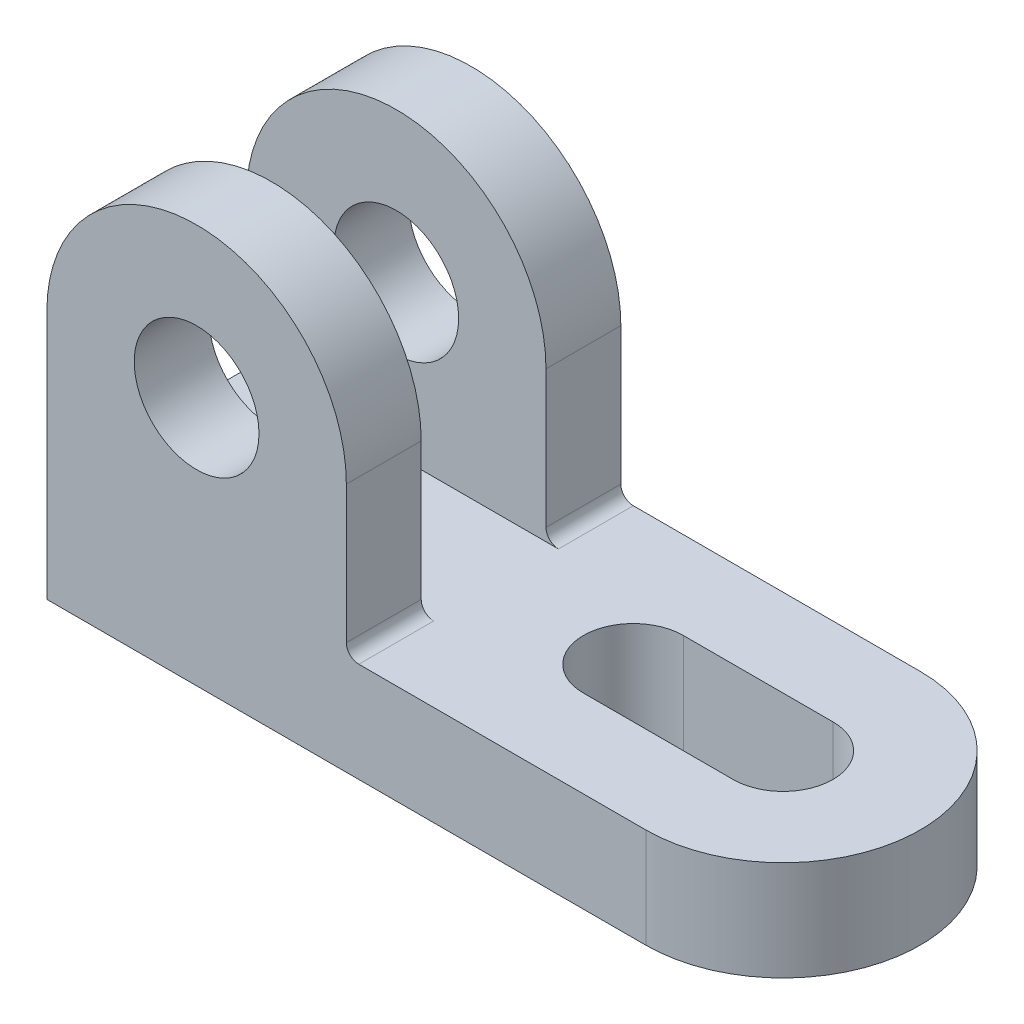
ISO-10303-21;
HEADER;
FILE_DESCRIPTION(('STEP AP214'),'2;1');
FILE_NAME('part.step','',(''),(''),'','','');
FILE_SCHEMA(('AUTOMOTIVE_DESIGN { 1 0 10303 214 1 1 1 1 }'));
ENDSEC;
DATA;
#1=APPLICATION_CONTEXT('core data for automotive mechanical design processes');
#2=APPLICATION_PROTOCOL_DEFINITION('international standard','automotive_design',2000,#1);
#3=PRODUCT_CONTEXT('',#1,'mechanical');
#4=PRODUCT('Part','Part','',(#3));
#5=PRODUCT_RELATED_PRODUCT_CATEGORY('part','',(#4));
#6=PRODUCT_DEFINITION_FORMATION('','',#4);
#7=PRODUCT_DEFINITION_CONTEXT('part definition',#1,'design');
#8=PRODUCT_DEFINITION('design','',#6,#7);
#9=PRODUCT_DEFINITION_SHAPE('','',#8);
#10=(LENGTH_UNIT() NAMED_UNIT(*) SI_UNIT(.MILLI.,.METRE.));
#11=(NAMED_UNIT(*) PLANE_ANGLE_UNIT() SI_UNIT($,.RADIAN.));
#12=(NAMED_UNIT(*) SI_UNIT($,.STERADIAN.) SOLID_ANGLE_UNIT());
#13=UNCERTAINTY_MEASURE_WITH_UNIT(LENGTH_MEASURE(1.E-05),#10,'distance_accuracy_value','');
#14=(GEOMETRIC_REPRESENTATION_CONTEXT(3) GLOBAL_UNCERTAINTY_ASSIGNED_CONTEXT((#13)) GLOBAL_UNIT_ASSIGNED_CONTEXT((#10,
#11,#12)) REPRESENTATION_CONTEXT('',''));
#15=CARTESIAN_POINT('',(0.,0.,0.));
#16=DIRECTION('',(0.,0.,1.));
#17=DIRECTION('',(1.,0.,0.));
#18=AXIS2_PLACEMENT_3D('',#15,#16,#17);
#19=CARTESIAN_POINT('',(0.,16.,0.));
#20=DIRECTION('',(0.,1.,0.));
#21=DIRECTION('',(0.,0.,1.));
#22=AXIS2_PLACEMENT_3D('',#19,#20,#21);
#23=PLANE('',#22);
#24=CARTESIAN_POINT('',(13.,16.,0.));
#25=DIRECTION('',(0.,1.,0.));
#26=DIRECTION('',(0.,0.,1.));
#27=AXIS2_PLACEMENT_3D('',#24,#25,#26);
#28=CIRCLE('',#27,8.);
#29=CARTESIAN_POINT('',(13.,16.,-8.));
#30=VERTEX_POINT('',#29);
#31=CARTESIAN_POINT('',(13.,16.,8.));
#32=VERTEX_POINT('',#31);
#33=EDGE_CURVE('E160',#30,#32,#28,.T.);
#34=ORIENTED_EDGE('',*,*,#33,.F.);
#35=DIRECTION('',(-1.,0.,0.));
#36=VECTOR('',#35,1.);
#37=CARTESIAN_POINT('',(13.,16.,-8.));
#38=LINE('',#37,#36);
#39=CARTESIAN_POINT('',(37.,16.,-8.));
#40=VERTEX_POINT('',#39);
#41=EDGE_CURVE('E181',#40,#30,#38,.T.);
#42=ORIENTED_EDGE('',*,*,#41,.F.);
#43=CARTESIAN_POINT('',(37.,16.,0.));
#44=DIRECTION('',(0.,1.,0.));
#45=DIRECTION('',(0.,0.,1.));
#46=AXIS2_PLACEMENT_3D('',#43,#44,#45);
#47=CIRCLE('',#46,8.);
#48=CARTESIAN_POINT('',(37.,16.,8.));
#49=VERTEX_POINT('',#48);
#50=EDGE_CURVE('E185',#49,#40,#47,.T.);
#51=ORIENTED_EDGE('',*,*,#50,.F.);
#52=DIRECTION('',(1.,0.,0.));
#53=VECTOR('',#52,1.);
#54=CARTESIAN_POINT('',(13.,16.,8.));
#55=LINE('',#54,#53);
#56=EDGE_CURVE('E194',#32,#49,#55,.T.);
#57=ORIENTED_EDGE('',*,*,#56,.F.);
#58=EDGE_LOOP('',(#34,#42,#51,#57));
#59=FACE_BOUND('',#58,.T.);
#60=DIRECTION('',(1.,0.,0.));
#61=VECTOR('',#60,1.);
#62=CARTESIAN_POINT('',(0.,16.,-22.));
#63=LINE('',#62,#61);
#64=CARTESIAN_POINT('',(-8.99999999999996,16.,-22.));
#65=VERTEX_POINT('',#64);
#66=CARTESIAN_POINT('',(37.,16.,-22.));
#67=VERTEX_POINT('',#66);
#68=EDGE_CURVE('E291',#65,#67,#63,.T.);
#69=ORIENTED_EDGE('',*,*,#68,.F.);
#70=DIRECTION('',(0.,0.,-1.));
#71=VECTOR('',#70,1.);
#72=CARTESIAN_POINT('',(-8.99999999999996,16.,0.));
#73=LINE('',#72,#71);
#74=CARTESIAN_POINT('',(-8.99999999999996,16.,-10.));
#75=VERTEX_POINT('',#74);
#76=EDGE_CURVE('E332',#65,#75,#73,.F.);
#77=ORIENTED_EDGE('',*,*,#76,.T.);
#78=DIRECTION('',(-1.,0.,0.));
#79=VECTOR('',#78,1.);
#80=CARTESIAN_POINT('',(0.,16.,-10.));
#81=LINE('',#80,#79);
#82=CARTESIAN_POINT('',(-59.,16.,-10.));
#83=VERTEX_POINT('',#82);
#84=EDGE_CURVE('E217',#75,#83,#81,.T.);
#85=ORIENTED_EDGE('',*,*,#84,.T.);
#86=DIRECTION('',(0.,0.,1.));
#87=VECTOR('',#86,1.);
#88=CARTESIAN_POINT('',(-59.,16.,0.));
#89=LINE('',#88,#87);
#90=CARTESIAN_POINT('',(-59.,16.,10.));
#91=VERTEX_POINT('',#90);
#92=EDGE_CURVE('E294',#83,#91,#89,.T.);
#93=ORIENTED_EDGE('',*,*,#92,.T.);
#94=DIRECTION('',(-1.,0.,0.));
#95=VECTOR('',#94,1.);
#96=CARTESIAN_POINT('',(0.,16.,10.));
#97=LINE('',#96,#95);
#98=CARTESIAN_POINT('',(-8.99999999999996,16.,10.));
#99=VERTEX_POINT('',#98);
#100=EDGE_CURVE('E261',#99,#91,#97,.T.);
#101=ORIENTED_EDGE('',*,*,#100,.F.);
#102=DIRECTION('',(0.,0.,1.));
#103=VECTOR('',#102,1.);
#104=CARTESIAN_POINT('',(-8.99999999999996,16.,22.));
#105=LINE('',#104,#103);
#106=CARTESIAN_POINT('',(-8.99999999999996,16.,22.));
#107=VERTEX_POINT('',#106);
#108=EDGE_CURVE('E328',#99,#107,#105,.T.);
#109=ORIENTED_EDGE('',*,*,#108,.T.);
#110=DIRECTION('',(1.,0.,0.));
#111=VECTOR('',#110,1.);
#112=CARTESIAN_POINT('',(0.,16.,22.));
#113=LINE('',#112,#111);
#114=CARTESIAN_POINT('',(37.,16.,22.));
#115=VERTEX_POINT('',#114);
#116=EDGE_CURVE('E283',#107,#115,#113,.T.);
#117=ORIENTED_EDGE('',*,*,#116,.T.);
#118=CARTESIAN_POINT('',(37.,16.,0.));
#119=DIRECTION('',(0.,1.,0.));
#120=DIRECTION('',(0.,0.,1.));
#121=AXIS2_PLACEMENT_3D('',#118,#119,#120);
#122=CIRCLE('',#121,22.);
#123=EDGE_CURVE('E286',#115,#67,#122,.T.);
#124=ORIENTED_EDGE('',*,*,#123,.T.);
#125=EDGE_LOOP('',(#69,#77,#85,#93,#101,#109,#117,#124));
#126=FACE_BOUND('',#125,.T.);
#127=ADVANCED_FACE('F40',(#59,#126),#23,.T.);
#128=CARTESIAN_POINT('',(0.,16.,22.));
#129=DIRECTION('',(0.,0.,-1.));
#130=DIRECTION('',(-1.,0.,0.));
#131=AXIS2_PLACEMENT_3D('',#128,#129,#130);
#132=PLANE('',#131);
#133=DIRECTION('',(1.,0.,0.));
#134=VECTOR('',#133,1.);
#135=CARTESIAN_POINT('',(0.,0.,22.));
#136=LINE('',#135,#134);
#137=CARTESIAN_POINT('',(-59.,0.,22.));
#138=VERTEX_POINT('',#137);
#139=CARTESIAN_POINT('',(37.,0.,22.));
#140=VERTEX_POINT('',#139);
#141=EDGE_CURVE('E279',#138,#140,#136,.T.);
#142=ORIENTED_EDGE('',*,*,#141,.T.);
#143=DIRECTION('',(0.,-1.,0.));
#144=VECTOR('',#143,1.);
#145=CARTESIAN_POINT('',(37.,16.,22.));
#146=LINE('',#145,#144);
#147=EDGE_CURVE('E320',#115,#140,#146,.T.);
#148=ORIENTED_EDGE('',*,*,#147,.F.);
#149=ORIENTED_EDGE('',*,*,#116,.F.);
#150=CARTESIAN_POINT('',(-8.99999999999996,18.,22.));
#151=DIRECTION('',(0.,0.,-1.));
#152=DIRECTION('',(-1.,0.,0.));
#153=AXIS2_PLACEMENT_3D('',#150,#151,#152);
#154=CIRCLE('',#153,2.);
#155=CARTESIAN_POINT('',(-11.,18.,22.));
#156=VERTEX_POINT('',#155);
#157=EDGE_CURVE('E49',#107,#156,#154,.T.);
#158=ORIENTED_EDGE('',*,*,#157,.T.);
#159=DIRECTION('',(0.,1.,0.));
#160=VECTOR('',#159,1.);
#161=CARTESIAN_POINT('',(-11.,0.,22.));
#162=LINE('',#161,#160);
#163=CARTESIAN_POINT('',(-11.,40.,22.));
#164=VERTEX_POINT('',#163);
#165=EDGE_CURVE('E269',#156,#164,#162,.T.);
#166=ORIENTED_EDGE('',*,*,#165,.T.);
#167=CARTESIAN_POINT('',(-35.,40.,22.));
#168=DIRECTION('',(0.,0.,1.));
#169=DIRECTION('',(1.,0.,0.));
#170=AXIS2_PLACEMENT_3D('',#167,#168,#169);
#171=CIRCLE('',#170,24.);
#172=CARTESIAN_POINT('',(-59.,40.,22.));
#173=VERTEX_POINT('',#172);
#174=EDGE_CURVE('E251',#164,#173,#171,.T.);
#175=ORIENTED_EDGE('',*,*,#174,.T.);
#176=DIRECTION('',(0.,-1.,0.));
#177=VECTOR('',#176,1.);
#178=CARTESIAN_POINT('',(-59.,16.,22.));
#179=LINE('',#178,#177);
#180=EDGE_CURVE('E297',#173,#138,#179,.T.);
#181=ORIENTED_EDGE('',*,*,#180,.T.);
#182=EDGE_LOOP('',(#142,#148,#149,#158,#166,#175,#181));
#183=FACE_BOUND('',#182,.T.);
#184=CARTESIAN_POINT('',(-35.,40.,22.));
#185=DIRECTION('',(0.,0.,1.));
#186=DIRECTION('',(1.,0.,0.));
#187=AXIS2_PLACEMENT_3D('',#184,#185,#186);
#188=CIRCLE('',#187,10.);
#189=CARTESIAN_POINT('',(-25.,40.,22.));
#190=VERTEX_POINT('',#189);
#191=EDGE_CURVE('E242',#190,#190,#188,.T.);
#192=ORIENTED_EDGE('',*,*,#191,.F.);
#193=EDGE_LOOP('',(#192));
#194=FACE_BOUND('',#193,.T.);
#195=ADVANCED_FACE('F374',(#183,#194),#132,.F.);
#196=CARTESIAN_POINT('',(37.,16.,0.));
#197=DIRECTION('',(0.,-1.,0.));
#198=DIRECTION('',(0.,0.,-1.));
#199=AXIS2_PLACEMENT_3D('',#196,#197,#198);
#200=CYLINDRICAL_SURFACE('',#199,22.);
#201=CARTESIAN_POINT('',(37.,0.,0.));
#202=DIRECTION('',(0.,1.,0.));
#203=DIRECTION('',(0.,0.,1.));
#204=AXIS2_PLACEMENT_3D('',#201,#202,#203);
#205=CIRCLE('',#204,22.);
#206=CARTESIAN_POINT('',(37.,0.,-22.));
#207=VERTEX_POINT('',#206);
#208=EDGE_CURVE('E301',#140,#207,#205,.T.);
#209=ORIENTED_EDGE('',*,*,#208,.T.);
#210=DIRECTION('',(0.,-1.,0.));
#211=VECTOR('',#210,1.);
#212=CARTESIAN_POINT('',(37.,16.,-22.));
#213=LINE('',#212,#211);
#214=EDGE_CURVE('E317',#67,#207,#213,.T.);
#215=ORIENTED_EDGE('',*,*,#214,.F.);
#216=ORIENTED_EDGE('',*,*,#123,.F.);
#217=ORIENTED_EDGE('',*,*,#147,.T.);
#218=EDGE_LOOP('',(#209,#215,#216,#217));
#219=FACE_BOUND('',#218,.T.);
#220=ADVANCED_FACE('F368',(#219),#200,.T.);
#221=CARTESIAN_POINT('',(0.,16.,-22.));
#222=DIRECTION('',(0.,0.,-1.));
#223=DIRECTION('',(-1.,0.,0.));
#224=AXIS2_PLACEMENT_3D('',#221,#222,#223);
#225=PLANE('',#224);
#226=DIRECTION('',(1.,0.,0.));
#227=VECTOR('',#226,1.);
#228=CARTESIAN_POINT('',(0.,0.,-22.));
#229=LINE('',#228,#227);
#230=CARTESIAN_POINT('',(-59.,0.,-22.));
#231=VERTEX_POINT('',#230);
#232=EDGE_CURVE('E305',#231,#207,#229,.T.);
#233=ORIENTED_EDGE('',*,*,#232,.F.);
#234=DIRECTION('',(0.,-1.,0.));
#235=VECTOR('',#234,1.);
#236=CARTESIAN_POINT('',(-59.,16.,-22.));
#237=LINE('',#236,#235);
#238=CARTESIAN_POINT('',(-59.,40.,-22.));
#239=VERTEX_POINT('',#238);
#240=EDGE_CURVE('E314',#239,#231,#237,.T.);
#241=ORIENTED_EDGE('',*,*,#240,.F.);
#242=CARTESIAN_POINT('',(-35.,40.,-22.));
#243=DIRECTION('',(0.,0.,1.));
#244=DIRECTION('',(1.,0.,0.));
#245=AXIS2_PLACEMENT_3D('',#242,#243,#244);
#246=CIRCLE('',#245,24.);
#247=CARTESIAN_POINT('',(-11.,40.,-22.));
#248=VERTEX_POINT('',#247);
#249=EDGE_CURVE('E214',#248,#239,#246,.T.);
#250=ORIENTED_EDGE('',*,*,#249,.F.);
#251=DIRECTION('',(0.,1.,0.));
#252=VECTOR('',#251,1.);
#253=CARTESIAN_POINT('',(-11.,0.,-22.));
#254=LINE('',#253,#252);
#255=CARTESIAN_POINT('',(-11.,18.,-22.));
#256=VERTEX_POINT('',#255);
#257=EDGE_CURVE('E232',#256,#248,#254,.T.);
#258=ORIENTED_EDGE('',*,*,#257,.F.);
#259=CARTESIAN_POINT('',(-8.99999999999996,18.,-22.));
#260=DIRECTION('',(0.,0.,-1.));
#261=DIRECTION('',(-1.,0.,0.));
#262=AXIS2_PLACEMENT_3D('',#259,#260,#261);
#263=CIRCLE('',#262,2.);
#264=EDGE_CURVE('E338',#256,#65,#263,.F.);
#265=ORIENTED_EDGE('',*,*,#264,.T.);
#266=ORIENTED_EDGE('',*,*,#68,.T.);
#267=ORIENTED_EDGE('',*,*,#214,.T.);
#268=EDGE_LOOP('',(#233,#241,#250,#258,#265,#266,#267));
#269=FACE_BOUND('',#268,.T.);
#270=CARTESIAN_POINT('',(-35.,40.,-22.));
#271=DIRECTION('',(0.,0.,1.));
#272=DIRECTION('',(1.,0.,0.));
#273=AXIS2_PLACEMENT_3D('',#270,#271,#272);
#274=CIRCLE('',#273,10.);
#275=CARTESIAN_POINT('',(-25.,40.,-22.));
#276=VERTEX_POINT('',#275);
#277=EDGE_CURVE('E203',#276,#276,#274,.T.);
#278=ORIENTED_EDGE('',*,*,#277,.T.);
#279=EDGE_LOOP('',(#278));
#280=FACE_BOUND('',#279,.T.);
#281=ADVANCED_FACE('F360',(#269,#280),#225,.T.);
#282=CARTESIAN_POINT('',(-59.,16.,0.));
#283=DIRECTION('',(1.,0.,0.));
#284=DIRECTION('',(0.,0.,-1.));
#285=AXIS2_PLACEMENT_3D('',#282,#283,#284);
#286=PLANE('',#285);
#287=DIRECTION('',(0.,0.,1.));
#288=VECTOR('',#287,1.);
#289=CARTESIAN_POINT('',(-59.,0.,0.));
#290=LINE('',#289,#288);
#291=EDGE_CURVE('E287',#231,#138,#290,.T.);
#292=ORIENTED_EDGE('',*,*,#291,.T.);
#293=ORIENTED_EDGE('',*,*,#180,.F.);
#294=DIRECTION('',(0.,0.,1.));
#295=VECTOR('',#294,1.);
#296=CARTESIAN_POINT('',(-59.,40.,10.));
#297=LINE('',#296,#295);
#298=CARTESIAN_POINT('',(-59.,40.,10.));
#299=VERTEX_POINT('',#298);
#300=EDGE_CURVE('E275',#299,#173,#297,.T.);
#301=ORIENTED_EDGE('',*,*,#300,.F.);
#302=DIRECTION('',(0.,1.,0.));
#303=VECTOR('',#302,1.);
#304=CARTESIAN_POINT('',(-59.,0.,10.));
#305=LINE('',#304,#303);
#306=EDGE_CURVE('E258',#91,#299,#305,.T.);
#307=ORIENTED_EDGE('',*,*,#306,.F.);
#308=ORIENTED_EDGE('',*,*,#92,.F.);
#309=DIRECTION('',(0.,1.,0.));
#310=VECTOR('',#309,1.);
#311=CARTESIAN_POINT('',(-59.,0.,-10.));
#312=LINE('',#311,#310);
#313=CARTESIAN_POINT('',(-59.,40.,-10.));
#314=VERTEX_POINT('',#313);
#315=EDGE_CURVE('E221',#83,#314,#312,.T.);
#316=ORIENTED_EDGE('',*,*,#315,.T.);
#317=DIRECTION('',(0.,0.,-1.));
#318=VECTOR('',#317,1.);
#319=CARTESIAN_POINT('',(-59.,40.,-10.));
#320=LINE('',#319,#318);
#321=EDGE_CURVE('E228',#314,#239,#320,.T.);
#322=ORIENTED_EDGE('',*,*,#321,.T.);
#323=ORIENTED_EDGE('',*,*,#240,.T.);
#324=EDGE_LOOP('',(#292,#293,#301,#307,#308,#316,#322,#323));
#325=FACE_BOUND('',#324,.T.);
#326=ADVANCED_FACE('F372',(#325),#286,.F.);
#327=CARTESIAN_POINT('',(0.,0.,0.));
#328=DIRECTION('',(0.,1.,0.));
#329=DIRECTION('',(0.,0.,1.));
#330=AXIS2_PLACEMENT_3D('',#327,#328,#329);
#331=PLANE('',#330);
#332=DIRECTION('',(-1.,0.,0.));
#333=VECTOR('',#332,1.);
#334=CARTESIAN_POINT('',(13.,0.,-8.));
#335=LINE('',#334,#333);
#336=CARTESIAN_POINT('',(37.,0.,-8.));
#337=VERTEX_POINT('',#336);
#338=CARTESIAN_POINT('',(13.,0.,-8.));
#339=VERTEX_POINT('',#338);
#340=EDGE_CURVE('E166',#337,#339,#335,.T.);
#341=ORIENTED_EDGE('',*,*,#340,.T.);
#342=CARTESIAN_POINT('',(13.,0.,0.));
#343=DIRECTION('',(0.,1.,0.));
#344=DIRECTION('',(0.,0.,1.));
#345=AXIS2_PLACEMENT_3D('',#342,#343,#344);
#346=CIRCLE('',#345,8.);
#347=CARTESIAN_POINT('',(13.,0.,8.));
#348=VERTEX_POINT('',#347);
#349=EDGE_CURVE('E157',#339,#348,#346,.T.);
#350=ORIENTED_EDGE('',*,*,#349,.T.);
#351=DIRECTION('',(1.,0.,0.));
#352=VECTOR('',#351,1.);
#353=CARTESIAN_POINT('',(13.,0.,8.));
#354=LINE('',#353,#352);
#355=CARTESIAN_POINT('',(37.,0.,8.));
#356=VERTEX_POINT('',#355);
#357=EDGE_CURVE('E170',#348,#356,#354,.T.);
#358=ORIENTED_EDGE('',*,*,#357,.T.);
#359=CARTESIAN_POINT('',(37.,0.,0.));
#360=DIRECTION('',(0.,1.,0.));
#361=DIRECTION('',(0.,0.,1.));
#362=AXIS2_PLACEMENT_3D('',#359,#360,#361);
#363=CIRCLE('',#362,8.);
#364=EDGE_CURVE('E175',#356,#337,#363,.T.);
#365=ORIENTED_EDGE('',*,*,#364,.T.);
#366=EDGE_LOOP('',(#341,#350,#358,#365));
#367=FACE_BOUND('',#366,.T.);
#368=ORIENTED_EDGE('',*,*,#141,.F.);
#369=ORIENTED_EDGE('',*,*,#291,.F.);
#370=ORIENTED_EDGE('',*,*,#232,.T.);
#371=ORIENTED_EDGE('',*,*,#208,.F.);
#372=EDGE_LOOP('',(#368,#369,#370,#371));
#373=FACE_BOUND('',#372,.T.);
#374=ADVANCED_FACE('F177',(#367,#373),#331,.F.);
#375=CARTESIAN_POINT('',(-11.,0.,10.));
#376=DIRECTION('',(1.,0.,0.));
#377=DIRECTION('',(0.,0.,-1.));
#378=AXIS2_PLACEMENT_3D('',#375,#376,#377);
#379=PLANE('',#378);
#380=ORIENTED_EDGE('',*,*,#165,.F.);
#381=DIRECTION('',(0.,0.,1.));
#382=VECTOR('',#381,1.);
#383=CARTESIAN_POINT('',(-11.,18.,10.));
#384=LINE('',#383,#382);
#385=CARTESIAN_POINT('',(-11.,18.,10.));
#386=VERTEX_POINT('',#385);
#387=EDGE_CURVE('E56',#156,#386,#384,.F.);
#388=ORIENTED_EDGE('',*,*,#387,.T.);
#389=DIRECTION('',(0.,1.,0.));
#390=VECTOR('',#389,1.);
#391=CARTESIAN_POINT('',(-11.,0.,10.));
#392=LINE('',#391,#390);
#393=CARTESIAN_POINT('',(-11.,40.,10.));
#394=VERTEX_POINT('',#393);
#395=EDGE_CURVE('E250',#386,#394,#392,.T.);
#396=ORIENTED_EDGE('',*,*,#395,.T.);
#397=DIRECTION('',(0.,0.,1.));
#398=VECTOR('',#397,1.);
#399=CARTESIAN_POINT('',(-11.,40.,10.));
#400=LINE('',#399,#398);
#401=EDGE_CURVE('E265',#394,#164,#400,.T.);
#402=ORIENTED_EDGE('',*,*,#401,.T.);
#403=EDGE_LOOP('',(#380,#388,#396,#402));
#404=FACE_BOUND('',#403,.T.);
#405=ADVANCED_FACE('F406',(#404),#379,.T.);
#406=CARTESIAN_POINT('',(-35.,40.,10.));
#407=DIRECTION('',(0.,0.,1.));
#408=DIRECTION('',(1.,0.,0.));
#409=AXIS2_PLACEMENT_3D('',#406,#407,#408);
#410=CYLINDRICAL_SURFACE('',#409,10.);
#411=CARTESIAN_POINT('',(-35.,40.,10.));
#412=DIRECTION('',(0.,0.,1.));
#413=DIRECTION('',(1.,0.,0.));
#414=AXIS2_PLACEMENT_3D('',#411,#412,#413);
#415=CIRCLE('',#414,10.);
#416=CARTESIAN_POINT('',(-25.,40.,10.));
#417=VERTEX_POINT('',#416);
#418=EDGE_CURVE('E246',#417,#417,#415,.T.);
#419=ORIENTED_EDGE('',*,*,#418,.F.);
#420=EDGE_LOOP('',(#419));
#421=FACE_BOUND('',#420,.T.);
#422=ORIENTED_EDGE('',*,*,#191,.T.);
#423=EDGE_LOOP('',(#422));
#424=FACE_BOUND('',#423,.T.);
#425=ADVANCED_FACE('F402',(#421,#424),#410,.F.);
#426=CARTESIAN_POINT('',(-35.,40.,10.));
#427=DIRECTION('',(0.,0.,1.));
#428=DIRECTION('',(1.,0.,0.));
#429=AXIS2_PLACEMENT_3D('',#426,#427,#428);
#430=CYLINDRICAL_SURFACE('',#429,24.);
#431=ORIENTED_EDGE('',*,*,#174,.F.);
#432=ORIENTED_EDGE('',*,*,#401,.F.);
#433=CARTESIAN_POINT('',(-35.,40.,10.));
#434=DIRECTION('',(0.,0.,1.));
#435=DIRECTION('',(1.,0.,0.));
#436=AXIS2_PLACEMENT_3D('',#433,#434,#435);
#437=CIRCLE('',#436,24.);
#438=EDGE_CURVE('E254',#394,#299,#437,.T.);
#439=ORIENTED_EDGE('',*,*,#438,.T.);
#440=ORIENTED_EDGE('',*,*,#300,.T.);
#441=EDGE_LOOP('',(#431,#432,#439,#440));
#442=FACE_BOUND('',#441,.T.);
#443=ADVANCED_FACE('F379',(#442),#430,.T.);
#444=CARTESIAN_POINT('',(0.,0.,10.));
#445=DIRECTION('',(0.,0.,1.));
#446=DIRECTION('',(1.,0.,0.));
#447=AXIS2_PLACEMENT_3D('',#444,#445,#446);
#448=PLANE('',#447);
#449=ORIENTED_EDGE('',*,*,#418,.T.);
#450=EDGE_LOOP('',(#449));
#451=FACE_BOUND('',#450,.T.);
#452=ORIENTED_EDGE('',*,*,#395,.F.);
#453=CARTESIAN_POINT('',(-8.99999999999996,18.,10.));
#454=DIRECTION('',(0.,0.,1.));
#455=DIRECTION('',(1.,0.,0.));
#456=AXIS2_PLACEMENT_3D('',#453,#454,#455);
#457=CIRCLE('',#456,2.);
#458=EDGE_CURVE('E11',#386,#99,#457,.T.);
#459=ORIENTED_EDGE('',*,*,#458,.T.);
#460=ORIENTED_EDGE('',*,*,#100,.T.);
#461=ORIENTED_EDGE('',*,*,#306,.T.);
#462=ORIENTED_EDGE('',*,*,#438,.F.);
#463=EDGE_LOOP('',(#452,#459,#460,#461,#462));
#464=FACE_BOUND('',#463,.T.);
#465=ADVANCED_FACE('F384',(#451,#464),#448,.F.);
#466=CARTESIAN_POINT('',(-11.,0.,-10.));
#467=DIRECTION('',(-1.,0.,0.));
#468=DIRECTION('',(0.,0.,1.));
#469=AXIS2_PLACEMENT_3D('',#466,#467,#468);
#470=PLANE('',#469);
#471=DIRECTION('',(0.,1.,0.));
#472=VECTOR('',#471,1.);
#473=CARTESIAN_POINT('',(-11.,0.,-10.));
#474=LINE('',#473,#472);
#475=CARTESIAN_POINT('',(-11.,18.,-10.));
#476=VERTEX_POINT('',#475);
#477=CARTESIAN_POINT('',(-11.,40.,-10.));
#478=VERTEX_POINT('',#477);
#479=EDGE_CURVE('E213',#476,#478,#474,.T.);
#480=ORIENTED_EDGE('',*,*,#479,.F.);
#481=DIRECTION('',(0.,0.,-1.));
#482=VECTOR('',#481,1.);
#483=CARTESIAN_POINT('',(-11.,18.,-10.));
#484=LINE('',#483,#482);
#485=EDGE_CURVE('E324',#476,#256,#484,.T.);
#486=ORIENTED_EDGE('',*,*,#485,.T.);
#487=ORIENTED_EDGE('',*,*,#257,.T.);
#488=DIRECTION('',(0.,0.,-1.));
#489=VECTOR('',#488,1.);
#490=CARTESIAN_POINT('',(-11.,40.,-10.));
#491=LINE('',#490,#489);
#492=EDGE_CURVE('E238',#478,#248,#491,.T.);
#493=ORIENTED_EDGE('',*,*,#492,.F.);
#494=EDGE_LOOP('',(#480,#486,#487,#493));
#495=FACE_BOUND('',#494,.T.);
#496=ADVANCED_FACE('F354',(#495),#470,.F.);
#497=CARTESIAN_POINT('',(-35.,40.,-10.));
#498=DIRECTION('',(0.,0.,-1.));
#499=DIRECTION('',(-1.,0.,0.));
#500=AXIS2_PLACEMENT_3D('',#497,#498,#499);
#501=CYLINDRICAL_SURFACE('',#500,24.);
#502=ORIENTED_EDGE('',*,*,#249,.T.);
#503=ORIENTED_EDGE('',*,*,#321,.F.);
#504=CARTESIAN_POINT('',(-35.,40.,-10.));
#505=DIRECTION('',(0.,0.,1.));
#506=DIRECTION('',(1.,0.,0.));
#507=AXIS2_PLACEMENT_3D('',#504,#505,#506);
#508=CIRCLE('',#507,24.);
#509=EDGE_CURVE('E225',#478,#314,#508,.T.);
#510=ORIENTED_EDGE('',*,*,#509,.F.);
#511=ORIENTED_EDGE('',*,*,#492,.T.);
#512=EDGE_LOOP('',(#502,#503,#510,#511));
#513=FACE_BOUND('',#512,.T.);
#514=ADVANCED_FACE('F473',(#513),#501,.T.);
#515=CARTESIAN_POINT('',(-35.,40.,-10.));
#516=DIRECTION('',(0.,0.,-1.));
#517=DIRECTION('',(-1.,0.,0.));
#518=AXIS2_PLACEMENT_3D('',#515,#516,#517);
#519=CYLINDRICAL_SURFACE('',#518,10.);
#520=CARTESIAN_POINT('',(-35.,40.,-10.));
#521=DIRECTION('',(0.,0.,1.));
#522=DIRECTION('',(1.,0.,0.));
#523=AXIS2_PLACEMENT_3D('',#520,#521,#522);
#524=CIRCLE('',#523,10.);
#525=CARTESIAN_POINT('',(-25.,40.,-10.));
#526=VERTEX_POINT('',#525);
#527=EDGE_CURVE('E209',#526,#526,#524,.T.);
#528=ORIENTED_EDGE('',*,*,#527,.T.);
#529=EDGE_LOOP('',(#528));
#530=FACE_BOUND('',#529,.T.);
#531=ORIENTED_EDGE('',*,*,#277,.F.);
#532=EDGE_LOOP('',(#531));
#533=FACE_BOUND('',#532,.T.);
#534=ADVANCED_FACE('F482',(#530,#533),#519,.F.);
#535=CARTESIAN_POINT('',(0.,0.,-10.));
#536=DIRECTION('',(0.,0.,-1.));
#537=DIRECTION('',(1.,0.,0.));
#538=AXIS2_PLACEMENT_3D('',#535,#536,#537);
#539=PLANE('',#538);
#540=ORIENTED_EDGE('',*,*,#527,.F.);
#541=EDGE_LOOP('',(#540));
#542=FACE_BOUND('',#541,.T.);
#543=ORIENTED_EDGE('',*,*,#84,.F.);
#544=CARTESIAN_POINT('',(-8.99999999999996,18.,-10.));
#545=DIRECTION('',(0.,0.,-1.));
#546=DIRECTION('',(-1.,0.,0.));
#547=AXIS2_PLACEMENT_3D('',#544,#545,#546);
#548=CIRCLE('',#547,2.);
#549=EDGE_CURVE('E341',#75,#476,#548,.T.);
#550=ORIENTED_EDGE('',*,*,#549,.T.);
#551=ORIENTED_EDGE('',*,*,#479,.T.);
#552=ORIENTED_EDGE('',*,*,#509,.T.);
#553=ORIENTED_EDGE('',*,*,#315,.F.);
#554=EDGE_LOOP('',(#543,#550,#551,#552,#553));
#555=FACE_BOUND('',#554,.T.);
#556=ADVANCED_FACE('F347',(#542,#555),#539,.F.);
#557=CARTESIAN_POINT('',(13.,0.,0.));
#558=DIRECTION('',(0.,1.,0.));
#559=DIRECTION('',(0.,0.,1.));
#560=AXIS2_PLACEMENT_3D('',#557,#558,#559);
#561=CYLINDRICAL_SURFACE('',#560,8.);
#562=ORIENTED_EDGE('',*,*,#33,.T.);
#563=DIRECTION('',(0.,1.,0.));
#564=VECTOR('',#563,1.);
#565=CARTESIAN_POINT('',(13.,0.,8.));
#566=LINE('',#565,#564);
#567=EDGE_CURVE('E153',#348,#32,#566,.T.);
#568=ORIENTED_EDGE('',*,*,#567,.F.);
#569=ORIENTED_EDGE('',*,*,#349,.F.);
#570=DIRECTION('',(0.,1.,0.));
#571=VECTOR('',#570,1.);
#572=CARTESIAN_POINT('',(13.,0.,-8.));
#573=LINE('',#572,#571);
#574=EDGE_CURVE('E200',#339,#30,#573,.T.);
#575=ORIENTED_EDGE('',*,*,#574,.T.);
#576=EDGE_LOOP('',(#562,#568,#569,#575));
#577=FACE_BOUND('',#576,.T.);
#578=ADVANCED_FACE('F155',(#577),#561,.F.);
#579=CARTESIAN_POINT('',(13.,0.,-8.));
#580=DIRECTION('',(0.,0.,-1.));
#581=DIRECTION('',(-1.,0.,0.));
#582=AXIS2_PLACEMENT_3D('',#579,#580,#581);
#583=PLANE('',#582);
#584=ORIENTED_EDGE('',*,*,#41,.T.);
#585=ORIENTED_EDGE('',*,*,#574,.F.);
#586=ORIENTED_EDGE('',*,*,#340,.F.);
#587=DIRECTION('',(0.,1.,0.));
#588=VECTOR('',#587,1.);
#589=CARTESIAN_POINT('',(37.,0.,-8.));
#590=LINE('',#589,#588);
#591=EDGE_CURVE('E204',#337,#40,#590,.T.);
#592=ORIENTED_EDGE('',*,*,#591,.T.);
#593=EDGE_LOOP('',(#584,#585,#586,#592));
#594=FACE_BOUND('',#593,.T.);
#595=ADVANCED_FACE('F505',(#594),#583,.F.);
#596=CARTESIAN_POINT('',(37.,0.,0.));
#597=DIRECTION('',(0.,1.,0.));
#598=DIRECTION('',(0.,0.,1.));
#599=AXIS2_PLACEMENT_3D('',#596,#597,#598);
#600=CYLINDRICAL_SURFACE('',#599,8.);
#601=ORIENTED_EDGE('',*,*,#50,.T.);
#602=ORIENTED_EDGE('',*,*,#591,.F.);
#603=ORIENTED_EDGE('',*,*,#364,.F.);
#604=DIRECTION('',(0.,1.,0.));
#605=VECTOR('',#604,1.);
#606=CARTESIAN_POINT('',(37.,0.,8.));
#607=LINE('',#606,#605);
#608=EDGE_CURVE('E165',#356,#49,#607,.T.);
#609=ORIENTED_EDGE('',*,*,#608,.T.);
#610=EDGE_LOOP('',(#601,#602,#603,#609));
#611=FACE_BOUND('',#610,.T.);
#612=ADVANCED_FACE('F511',(#611),#600,.F.);
#613=CARTESIAN_POINT('',(13.,0.,8.));
#614=DIRECTION('',(0.,0.,1.));
#615=DIRECTION('',(1.,0.,0.));
#616=AXIS2_PLACEMENT_3D('',#613,#614,#615);
#617=PLANE('',#616);
#618=ORIENTED_EDGE('',*,*,#56,.T.);
#619=ORIENTED_EDGE('',*,*,#608,.F.);
#620=ORIENTED_EDGE('',*,*,#357,.F.);
#621=ORIENTED_EDGE('',*,*,#567,.T.);
#622=EDGE_LOOP('',(#618,#619,#620,#621));
#623=FACE_BOUND('',#622,.T.);
#624=ADVANCED_FACE('F171',(#623),#617,.F.);
#625=CARTESIAN_POINT('',(-8.99999999999996,18.,-10.));
#626=DIRECTION('',(0.,0.,-1.));
#627=DIRECTION('',(-1.,0.,0.));
#628=AXIS2_PLACEMENT_3D('',#625,#626,#627);
#629=CYLINDRICAL_SURFACE('',#628,2.);
#630=ORIENTED_EDGE('',*,*,#549,.F.);
#631=ORIENTED_EDGE('',*,*,#76,.F.);
#632=ORIENTED_EDGE('',*,*,#264,.F.);
#633=ORIENTED_EDGE('',*,*,#485,.F.);
#634=EDGE_LOOP('',(#630,#631,#632,#633));
#635=FACE_BOUND('',#634,.T.);
#636=ADVANCED_FACE('F356',(#635),#629,.F.);
#637=CARTESIAN_POINT('',(-8.99999999999996,18.,0.));
#638=DIRECTION('',(0.,0.,-1.));
#639=DIRECTION('',(-1.,0.,0.));
#640=AXIS2_PLACEMENT_3D('',#637,#638,#639);
#641=CYLINDRICAL_SURFACE('',#640,2.);
#642=ORIENTED_EDGE('',*,*,#458,.F.);
#643=ORIENTED_EDGE('',*,*,#387,.F.);
#644=ORIENTED_EDGE('',*,*,#157,.F.);
#645=ORIENTED_EDGE('',*,*,#108,.F.);
#646=EDGE_LOOP('',(#642,#643,#644,#645));
#647=FACE_BOUND('',#646,.T.);
#648=ADVANCED_FACE('F42',(#647),#641,.F.);
#649=CLOSED_SHELL('',(#127,#195,#220,#281,#326,#374,#405,#425,#443,#465,#496,#514,#534,#556,
#578,#595,#612,#624,#636,#648));
#650=MANIFOLD_SOLID_BREP('B2',#649);
#651=ADVANCED_BREP_SHAPE_REPRESENTATION('',(#18,#650),#14);
#652=SHAPE_DEFINITION_REPRESENTATION(#9,#651);
ENDSEC;
END-ISO-10303-21;
